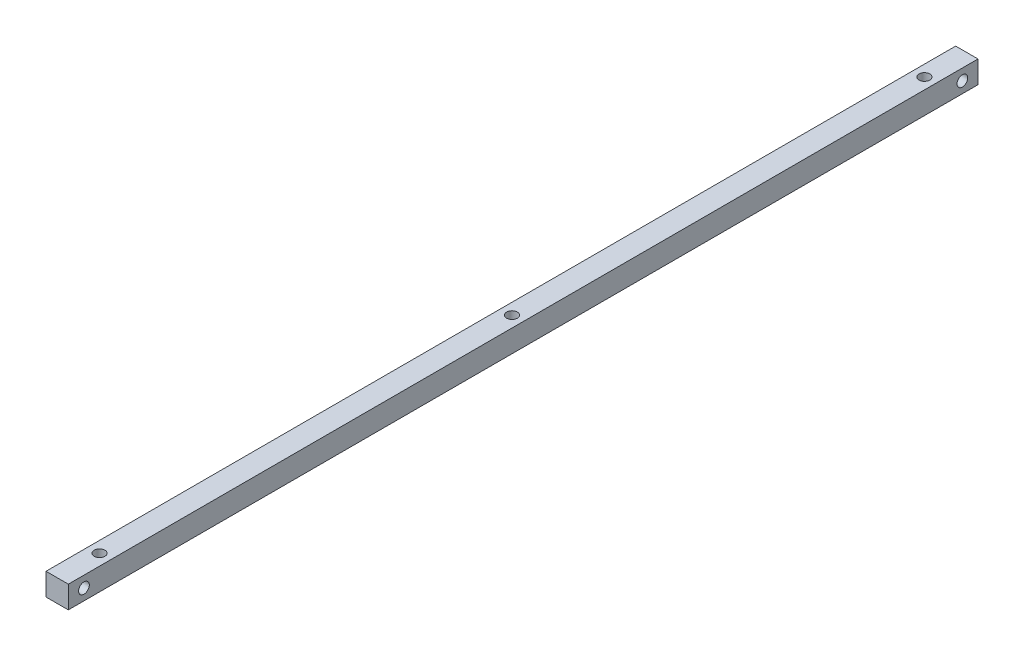
ISO-10303-21;
HEADER;
FILE_DESCRIPTION(('STEP AP214'),'2;1');
FILE_NAME('part.step','',(''),(''),'','','');
FILE_SCHEMA(('AUTOMOTIVE_DESIGN { 1 0 10303 214 1 1 1 1 }'));
ENDSEC;
DATA;
#1=APPLICATION_CONTEXT('core data for automotive mechanical design processes');
#2=APPLICATION_PROTOCOL_DEFINITION('international standard','automotive_design',2000,#1);
#3=PRODUCT_CONTEXT('',#1,'mechanical');
#4=PRODUCT('Part','Part','',(#3));
#5=PRODUCT_RELATED_PRODUCT_CATEGORY('part','',(#4));
#6=PRODUCT_DEFINITION_FORMATION('','',#4);
#7=PRODUCT_DEFINITION_CONTEXT('part definition',#1,'design');
#8=PRODUCT_DEFINITION('design','',#6,#7);
#9=PRODUCT_DEFINITION_SHAPE('','',#8);
#10=(LENGTH_UNIT() NAMED_UNIT(*) SI_UNIT(.MILLI.,.METRE.));
#11=(NAMED_UNIT(*) PLANE_ANGLE_UNIT() SI_UNIT($,.RADIAN.));
#12=(NAMED_UNIT(*) SI_UNIT($,.STERADIAN.) SOLID_ANGLE_UNIT());
#13=UNCERTAINTY_MEASURE_WITH_UNIT(LENGTH_MEASURE(1.E-05),#10,'distance_accuracy_value','');
#14=(GEOMETRIC_REPRESENTATION_CONTEXT(3) GLOBAL_UNCERTAINTY_ASSIGNED_CONTEXT((#13)) GLOBAL_UNIT_ASSIGNED_CONTEXT((#10,
#11,#12)) REPRESENTATION_CONTEXT('',''));
#15=CARTESIAN_POINT('',(0.,0.,0.));
#16=DIRECTION('',(0.,0.,1.));
#17=DIRECTION('',(1.,0.,0.));
#18=AXIS2_PLACEMENT_3D('',#15,#16,#17);
#19=CARTESIAN_POINT('',(3.125,-3.125,127.35));
#20=DIRECTION('',(0.,0.,-1.));
#21=DIRECTION('',(-1.,0.,0.));
#22=AXIS2_PLACEMENT_3D('',#19,#20,#21);
#23=PLANE('',#22);
#24=DIRECTION('',(0.,-1.,0.));
#25=VECTOR('',#24,1.);
#26=CARTESIAN_POINT('',(-3.125,-3.125,127.35));
#27=LINE('',#26,#25);
#28=CARTESIAN_POINT('',(-3.125,3.125,127.35));
#29=VERTEX_POINT('',#28);
#30=CARTESIAN_POINT('',(-3.125,-3.125,127.35));
#31=VERTEX_POINT('',#30);
#32=EDGE_CURVE('E99',#29,#31,#27,.T.);
#33=ORIENTED_EDGE('',*,*,#32,.T.);
#34=DIRECTION('',(-1.,0.,0.));
#35=VECTOR('',#34,1.);
#36=CARTESIAN_POINT('',(3.125,-3.125,127.35));
#37=LINE('',#36,#35);
#38=CARTESIAN_POINT('',(3.125,-3.125,127.35));
#39=VERTEX_POINT('',#38);
#40=EDGE_CURVE('E11',#39,#31,#37,.T.);
#41=ORIENTED_EDGE('',*,*,#40,.F.);
#42=DIRECTION('',(0.,-1.,0.));
#43=VECTOR('',#42,1.);
#44=CARTESIAN_POINT('',(3.125,-3.125,127.35));
#45=LINE('',#44,#43);
#46=CARTESIAN_POINT('',(3.125,3.125,127.35));
#47=VERTEX_POINT('',#46);
#48=EDGE_CURVE('E86',#47,#39,#45,.T.);
#49=ORIENTED_EDGE('',*,*,#48,.F.);
#50=DIRECTION('',(-1.,0.,0.));
#51=VECTOR('',#50,1.);
#52=CARTESIAN_POINT('',(3.125,3.125,127.35));
#53=LINE('',#52,#51);
#54=EDGE_CURVE('E95',#47,#29,#53,.T.);
#55=ORIENTED_EDGE('',*,*,#54,.T.);
#56=EDGE_LOOP('',(#33,#41,#49,#55));
#57=FACE_BOUND('',#56,.T.);
#58=ADVANCED_FACE('F33',(#57),#23,.F.);
#59=CARTESIAN_POINT('',(3.125,-3.125,127.35));
#60=DIRECTION('',(0.,1.,0.));
#61=DIRECTION('',(0.,0.,1.));
#62=AXIS2_PLACEMENT_3D('',#59,#60,#61);
#63=PLANE('',#62);
#64=CARTESIAN_POINT('',(0.,-3.12500000000001,0.));
#65=DIRECTION('',(0.,1.,0.));
#66=DIRECTION('',(0.,0.,1.));
#67=AXIS2_PLACEMENT_3D('',#64,#65,#66);
#68=CIRCLE('',#67,1.5);
#69=CARTESIAN_POINT('',(0.,-3.12500000000001,1.5));
#70=VERTEX_POINT('',#69);
#71=EDGE_CURVE('E121',#70,#70,#68,.T.);
#72=ORIENTED_EDGE('',*,*,#71,.T.);
#73=EDGE_LOOP('',(#72));
#74=FACE_BOUND('',#73,.T.);
#75=CARTESIAN_POINT('',(0.,-3.12500000000001,-115.475));
#76=DIRECTION('',(0.,1.,0.));
#77=DIRECTION('',(0.,0.,1.));
#78=AXIS2_PLACEMENT_3D('',#75,#76,#77);
#79=CIRCLE('',#78,1.5);
#80=CARTESIAN_POINT('',(0.,-3.12500000000001,-113.975));
#81=VERTEX_POINT('',#80);
#82=EDGE_CURVE('E118',#81,#81,#79,.T.);
#83=ORIENTED_EDGE('',*,*,#82,.T.);
#84=EDGE_LOOP('',(#83));
#85=FACE_BOUND('',#84,.T.);
#86=CARTESIAN_POINT('',(0.,-3.125,115.475));
#87=DIRECTION('',(0.,1.,0.));
#88=DIRECTION('',(0.,0.,1.));
#89=AXIS2_PLACEMENT_3D('',#86,#87,#88);
#90=CIRCLE('',#89,1.5);
#91=CARTESIAN_POINT('',(0.,-3.125,116.975));
#92=VERTEX_POINT('',#91);
#93=EDGE_CURVE('E115',#92,#92,#90,.T.);
#94=ORIENTED_EDGE('',*,*,#93,.T.);
#95=EDGE_LOOP('',(#94));
#96=FACE_BOUND('',#95,.T.);
#97=DIRECTION('',(0.,0.,-1.));
#98=VECTOR('',#97,1.);
#99=CARTESIAN_POINT('',(-3.125,-3.125,127.35));
#100=LINE('',#99,#98);
#101=CARTESIAN_POINT('',(-3.125,-3.12500000000002,-127.35));
#102=VERTEX_POINT('',#101);
#103=EDGE_CURVE('E90',#31,#102,#100,.T.);
#104=ORIENTED_EDGE('',*,*,#103,.T.);
#105=DIRECTION('',(-1.,0.,0.));
#106=VECTOR('',#105,1.);
#107=CARTESIAN_POINT('',(3.125,-3.12500000000002,-127.35));
#108=LINE('',#107,#106);
#109=CARTESIAN_POINT('',(3.125,-3.12500000000002,-127.35));
#110=VERTEX_POINT('',#109);
#111=EDGE_CURVE('E42',#110,#102,#108,.T.);
#112=ORIENTED_EDGE('',*,*,#111,.F.);
#113=DIRECTION('',(0.,0.,-1.));
#114=VECTOR('',#113,1.);
#115=CARTESIAN_POINT('',(3.125,-3.125,127.35));
#116=LINE('',#115,#114);
#117=EDGE_CURVE('E81',#39,#110,#116,.T.);
#118=ORIENTED_EDGE('',*,*,#117,.F.);
#119=ORIENTED_EDGE('',*,*,#40,.T.);
#120=EDGE_LOOP('',(#104,#112,#118,#119));
#121=FACE_BOUND('',#120,.T.);
#122=ADVANCED_FACE('F89',(#74,#85,#96,#121),#63,.F.);
#123=CARTESIAN_POINT('',(3.125,-3.12500000000002,-127.35));
#124=DIRECTION('',(0.,0.,1.));
#125=DIRECTION('',(1.,0.,0.));
#126=AXIS2_PLACEMENT_3D('',#123,#124,#125);
#127=PLANE('',#126);
#128=DIRECTION('',(0.,1.,0.));
#129=VECTOR('',#128,1.);
#130=CARTESIAN_POINT('',(-3.125,-3.12500000000002,-127.35));
#131=LINE('',#130,#129);
#132=CARTESIAN_POINT('',(-3.125,3.12500000000002,-127.35));
#133=VERTEX_POINT('',#132);
#134=EDGE_CURVE('E68',#102,#133,#131,.T.);
#135=ORIENTED_EDGE('',*,*,#134,.T.);
#136=DIRECTION('',(-1.,0.,0.));
#137=VECTOR('',#136,1.);
#138=CARTESIAN_POINT('',(3.125,3.12500000000002,-127.35));
#139=LINE('',#138,#137);
#140=CARTESIAN_POINT('',(3.125,3.12500000000002,-127.35));
#141=VERTEX_POINT('',#140);
#142=EDGE_CURVE('E91',#141,#133,#139,.T.);
#143=ORIENTED_EDGE('',*,*,#142,.F.);
#144=DIRECTION('',(0.,1.,0.));
#145=VECTOR('',#144,1.);
#146=CARTESIAN_POINT('',(3.125,-3.12500000000002,-127.35));
#147=LINE('',#146,#145);
#148=EDGE_CURVE('E84',#110,#141,#147,.T.);
#149=ORIENTED_EDGE('',*,*,#148,.F.);
#150=ORIENTED_EDGE('',*,*,#111,.T.);
#151=EDGE_LOOP('',(#135,#143,#149,#150));
#152=FACE_BOUND('',#151,.T.);
#153=ADVANCED_FACE('F93',(#152),#127,.F.);
#154=CARTESIAN_POINT('',(3.125,3.125,127.35));
#155=DIRECTION('',(0.,-1.,0.));
#156=DIRECTION('',(0.,0.,-1.));
#157=AXIS2_PLACEMENT_3D('',#154,#155,#156);
#158=PLANE('',#157);
#159=CARTESIAN_POINT('',(0.,3.12500000000001,0.));
#160=DIRECTION('',(0.,-1.,0.));
#161=DIRECTION('',(0.,0.,-1.));
#162=AXIS2_PLACEMENT_3D('',#159,#160,#161);
#163=CIRCLE('',#162,1.5);
#164=CARTESIAN_POINT('',(0.,3.12500000000001,-1.5));
#165=VERTEX_POINT('',#164);
#166=EDGE_CURVE('E36',#165,#165,#163,.T.);
#167=ORIENTED_EDGE('',*,*,#166,.T.);
#168=EDGE_LOOP('',(#167));
#169=FACE_BOUND('',#168,.T.);
#170=CARTESIAN_POINT('',(0.,3.12500000000001,-115.475));
#171=DIRECTION('',(0.,-1.,0.));
#172=DIRECTION('',(0.,0.,-1.));
#173=AXIS2_PLACEMENT_3D('',#170,#171,#172);
#174=CIRCLE('',#173,1.5);
#175=CARTESIAN_POINT('',(0.,3.12500000000001,-116.975));
#176=VERTEX_POINT('',#175);
#177=EDGE_CURVE('E119',#176,#176,#174,.T.);
#178=ORIENTED_EDGE('',*,*,#177,.T.);
#179=EDGE_LOOP('',(#178));
#180=FACE_BOUND('',#179,.T.);
#181=CARTESIAN_POINT('',(0.,3.125,115.475));
#182=DIRECTION('',(0.,-1.,0.));
#183=DIRECTION('',(0.,0.,-1.));
#184=AXIS2_PLACEMENT_3D('',#181,#182,#183);
#185=CIRCLE('',#184,1.5);
#186=CARTESIAN_POINT('',(0.,3.125,113.975));
#187=VERTEX_POINT('',#186);
#188=EDGE_CURVE('E116',#187,#187,#185,.T.);
#189=ORIENTED_EDGE('',*,*,#188,.T.);
#190=EDGE_LOOP('',(#189));
#191=FACE_BOUND('',#190,.T.);
#192=DIRECTION('',(0.,0.,1.));
#193=VECTOR('',#192,1.);
#194=CARTESIAN_POINT('',(-3.125,3.125,127.35));
#195=LINE('',#194,#193);
#196=EDGE_CURVE('E74',#133,#29,#195,.T.);
#197=ORIENTED_EDGE('',*,*,#196,.T.);
#198=ORIENTED_EDGE('',*,*,#54,.F.);
#199=DIRECTION('',(0.,0.,1.));
#200=VECTOR('',#199,1.);
#201=CARTESIAN_POINT('',(3.125,3.125,127.35));
#202=LINE('',#201,#200);
#203=EDGE_CURVE('E51',#141,#47,#202,.T.);
#204=ORIENTED_EDGE('',*,*,#203,.F.);
#205=ORIENTED_EDGE('',*,*,#142,.T.);
#206=EDGE_LOOP('',(#197,#198,#204,#205));
#207=FACE_BOUND('',#206,.T.);
#208=ADVANCED_FACE('F165',(#169,#180,#191,#207),#158,.F.);
#209=CARTESIAN_POINT('',(3.125,0.,0.));
#210=DIRECTION('',(-1.,0.,0.));
#211=DIRECTION('',(0.,0.,1.));
#212=AXIS2_PLACEMENT_3D('',#209,#210,#211);
#213=PLANE('',#212);
#214=CARTESIAN_POINT('',(3.125,0.,-122.975));
#215=DIRECTION('',(-1.,0.,0.));
#216=DIRECTION('',(0.,0.,1.));
#217=AXIS2_PLACEMENT_3D('',#214,#215,#216);
#218=CIRCLE('',#217,1.49999999999998);
#219=CARTESIAN_POINT('',(3.125,0.,-121.475));
#220=VERTEX_POINT('',#219);
#221=EDGE_CURVE('E111',#220,#220,#218,.T.);
#222=ORIENTED_EDGE('',*,*,#221,.T.);
#223=EDGE_LOOP('',(#222));
#224=FACE_BOUND('',#223,.T.);
#225=CARTESIAN_POINT('',(3.125,0.,122.975));
#226=DIRECTION('',(-1.,0.,0.));
#227=DIRECTION('',(0.,0.,1.));
#228=AXIS2_PLACEMENT_3D('',#225,#226,#227);
#229=CIRCLE('',#228,1.5);
#230=CARTESIAN_POINT('',(3.125,0.,124.475));
#231=VERTEX_POINT('',#230);
#232=EDGE_CURVE('E102',#231,#231,#229,.T.);
#233=ORIENTED_EDGE('',*,*,#232,.T.);
#234=EDGE_LOOP('',(#233));
#235=FACE_BOUND('',#234,.T.);
#236=ORIENTED_EDGE('',*,*,#48,.T.);
#237=ORIENTED_EDGE('',*,*,#117,.T.);
#238=ORIENTED_EDGE('',*,*,#148,.T.);
#239=ORIENTED_EDGE('',*,*,#203,.T.);
#240=EDGE_LOOP('',(#236,#237,#238,#239));
#241=FACE_BOUND('',#240,.T.);
#242=ADVANCED_FACE('F82',(#224,#235,#241),#213,.F.);
#243=CARTESIAN_POINT('',(-3.125,0.,0.));
#244=DIRECTION('',(-1.,0.,0.));
#245=DIRECTION('',(0.,0.,1.));
#246=AXIS2_PLACEMENT_3D('',#243,#244,#245);
#247=PLANE('',#246);
#248=CARTESIAN_POINT('',(-3.125,0.,-122.975));
#249=DIRECTION('',(-1.,0.,0.));
#250=DIRECTION('',(0.,0.,1.));
#251=AXIS2_PLACEMENT_3D('',#248,#249,#250);
#252=CIRCLE('',#251,1.49999999999998);
#253=CARTESIAN_POINT('',(-3.125,0.,-121.475));
#254=VERTEX_POINT('',#253);
#255=EDGE_CURVE('E112',#254,#254,#252,.T.);
#256=ORIENTED_EDGE('',*,*,#255,.F.);
#257=EDGE_LOOP('',(#256));
#258=FACE_BOUND('',#257,.T.);
#259=CARTESIAN_POINT('',(-3.125,0.,122.975));
#260=DIRECTION('',(-1.,0.,0.));
#261=DIRECTION('',(0.,0.,1.));
#262=AXIS2_PLACEMENT_3D('',#259,#260,#261);
#263=CIRCLE('',#262,1.5);
#264=CARTESIAN_POINT('',(-3.125,0.,124.475));
#265=VERTEX_POINT('',#264);
#266=EDGE_CURVE('E108',#265,#265,#263,.T.);
#267=ORIENTED_EDGE('',*,*,#266,.F.);
#268=EDGE_LOOP('',(#267));
#269=FACE_BOUND('',#268,.T.);
#270=ORIENTED_EDGE('',*,*,#32,.F.);
#271=ORIENTED_EDGE('',*,*,#196,.F.);
#272=ORIENTED_EDGE('',*,*,#134,.F.);
#273=ORIENTED_EDGE('',*,*,#103,.F.);
#274=EDGE_LOOP('',(#270,#271,#272,#273));
#275=FACE_BOUND('',#274,.T.);
#276=ADVANCED_FACE('F143',(#258,#269,#275),#247,.T.);
#277=CARTESIAN_POINT('',(-16.875,0.,122.975));
#278=DIRECTION('',(1.,0.,0.));
#279=DIRECTION('',(0.,0.,-1.));
#280=AXIS2_PLACEMENT_3D('',#277,#278,#279);
#281=CYLINDRICAL_SURFACE('',#280,1.5);
#282=ORIENTED_EDGE('',*,*,#266,.T.);
#283=EDGE_LOOP('',(#282));
#284=FACE_BOUND('',#283,.T.);
#285=ORIENTED_EDGE('',*,*,#232,.F.);
#286=EDGE_LOOP('',(#285));
#287=FACE_BOUND('',#286,.T.);
#288=ADVANCED_FACE('F140',(#284,#287),#281,.F.);
#289=CARTESIAN_POINT('',(-16.875,0.,-122.975));
#290=DIRECTION('',(1.,0.,0.));
#291=DIRECTION('',(0.,0.,-1.));
#292=AXIS2_PLACEMENT_3D('',#289,#290,#291);
#293=CYLINDRICAL_SURFACE('',#292,1.49999999999998);
#294=ORIENTED_EDGE('',*,*,#255,.T.);
#295=EDGE_LOOP('',(#294));
#296=FACE_BOUND('',#295,.T.);
#297=ORIENTED_EDGE('',*,*,#221,.F.);
#298=EDGE_LOOP('',(#297));
#299=FACE_BOUND('',#298,.T.);
#300=ADVANCED_FACE('F142',(#296,#299),#293,.F.);
#301=CARTESIAN_POINT('',(0.,26.875,115.475));
#302=DIRECTION('',(0.,-1.,0.));
#303=DIRECTION('',(0.,0.,-1.));
#304=AXIS2_PLACEMENT_3D('',#301,#302,#303);
#305=CYLINDRICAL_SURFACE('',#304,1.5);
#306=ORIENTED_EDGE('',*,*,#188,.F.);
#307=EDGE_LOOP('',(#306));
#308=FACE_BOUND('',#307,.T.);
#309=ORIENTED_EDGE('',*,*,#93,.F.);
#310=EDGE_LOOP('',(#309));
#311=FACE_BOUND('',#310,.T.);
#312=ADVANCED_FACE('F150',(#308,#311),#305,.F.);
#313=CARTESIAN_POINT('',(0.,26.875,-115.475));
#314=DIRECTION('',(0.,-1.,0.));
#315=DIRECTION('',(0.,0.,-1.));
#316=AXIS2_PLACEMENT_3D('',#313,#314,#315);
#317=CYLINDRICAL_SURFACE('',#316,1.5);
#318=ORIENTED_EDGE('',*,*,#177,.F.);
#319=EDGE_LOOP('',(#318));
#320=FACE_BOUND('',#319,.T.);
#321=ORIENTED_EDGE('',*,*,#82,.F.);
#322=EDGE_LOOP('',(#321));
#323=FACE_BOUND('',#322,.T.);
#324=ADVANCED_FACE('F182',(#320,#323),#317,.F.);
#325=CARTESIAN_POINT('',(0.,26.875,0.));
#326=DIRECTION('',(0.,-1.,0.));
#327=DIRECTION('',(0.,0.,-1.));
#328=AXIS2_PLACEMENT_3D('',#325,#326,#327);
#329=CYLINDRICAL_SURFACE('',#328,1.5);
#330=ORIENTED_EDGE('',*,*,#166,.F.);
#331=EDGE_LOOP('',(#330));
#332=FACE_BOUND('',#331,.T.);
#333=ORIENTED_EDGE('',*,*,#71,.F.);
#334=EDGE_LOOP('',(#333));
#335=FACE_BOUND('',#334,.T.);
#336=ADVANCED_FACE('F188',(#332,#335),#329,.F.);
#337=CLOSED_SHELL('',(#58,#122,#153,#208,#242,#276,#288,#300,#312,#324,#336));
#338=MANIFOLD_SOLID_BREP('B2',#337);
#339=ADVANCED_BREP_SHAPE_REPRESENTATION('',(#18,#338),#14);
#340=SHAPE_DEFINITION_REPRESENTATION(#9,#339);
ENDSEC;
END-ISO-10303-21;
